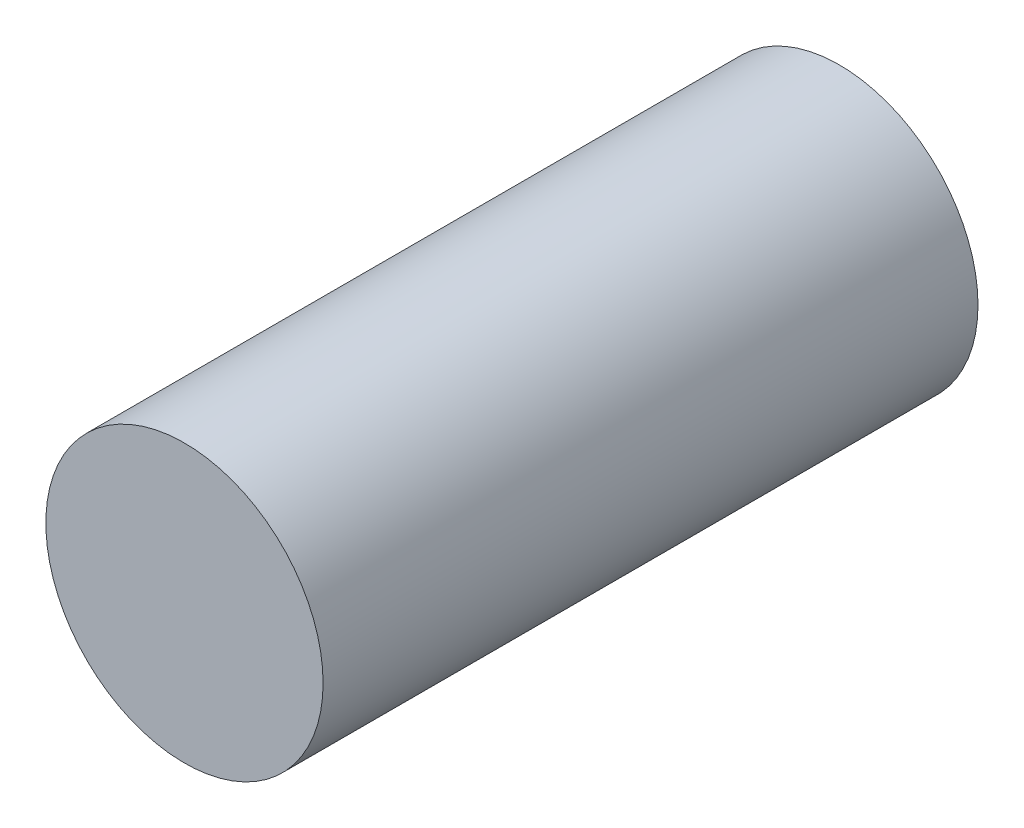
ISO-10303-21;
HEADER;
FILE_DESCRIPTION(('STEP AP214'),'2;1');
FILE_NAME('part.step','',(''),(''),'','','');
FILE_SCHEMA(('AUTOMOTIVE_DESIGN { 1 0 10303 214 1 1 1 1 }'));
ENDSEC;
DATA;
#1=APPLICATION_CONTEXT('core data for automotive mechanical design processes');
#2=APPLICATION_PROTOCOL_DEFINITION('international standard','automotive_design',2000,#1);
#3=PRODUCT_CONTEXT('',#1,'mechanical');
#4=PRODUCT('Part','Part','',(#3));
#5=PRODUCT_RELATED_PRODUCT_CATEGORY('part','',(#4));
#6=PRODUCT_DEFINITION_FORMATION('','',#4);
#7=PRODUCT_DEFINITION_CONTEXT('part definition',#1,'design');
#8=PRODUCT_DEFINITION('design','',#6,#7);
#9=PRODUCT_DEFINITION_SHAPE('','',#8);
#10=(LENGTH_UNIT() NAMED_UNIT(*) SI_UNIT(.MILLI.,.METRE.));
#11=(NAMED_UNIT(*) PLANE_ANGLE_UNIT() SI_UNIT($,.RADIAN.));
#12=(NAMED_UNIT(*) SI_UNIT($,.STERADIAN.) SOLID_ANGLE_UNIT());
#13=UNCERTAINTY_MEASURE_WITH_UNIT(LENGTH_MEASURE(1.E-05),#10,'distance_accuracy_value','');
#14=(GEOMETRIC_REPRESENTATION_CONTEXT(3) GLOBAL_UNCERTAINTY_ASSIGNED_CONTEXT((#13)) GLOBAL_UNIT_ASSIGNED_CONTEXT((#10,
#11,#12)) REPRESENTATION_CONTEXT('',''));
#15=CARTESIAN_POINT('',(0.,0.,0.));
#16=DIRECTION('',(0.,0.,1.));
#17=DIRECTION('',(1.,0.,0.));
#18=AXIS2_PLACEMENT_3D('',#15,#16,#17);
#19=CARTESIAN_POINT('',(0.,0.,60.));
#20=DIRECTION('',(0.,0.,-1.));
#21=DIRECTION('',(-1.,0.,0.));
#22=AXIS2_PLACEMENT_3D('',#19,#20,#21);
#23=CYLINDRICAL_SURFACE('',#22,12.7);
#24=CARTESIAN_POINT('',(0.,0.,60.));
#25=DIRECTION('',(0.,0.,1.));
#26=DIRECTION('',(1.,0.,0.));
#27=AXIS2_PLACEMENT_3D('',#24,#25,#26);
#28=CIRCLE('',#27,12.7);
#29=CARTESIAN_POINT('',(12.7,0.,60.));
#30=VERTEX_POINT('',#29);
#31=EDGE_CURVE('E10',#30,#30,#28,.T.);
#32=ORIENTED_EDGE('',*,*,#31,.F.);
#33=EDGE_LOOP('',(#32));
#34=FACE_BOUND('',#33,.T.);
#35=CARTESIAN_POINT('',(0.,0.,0.));
#36=DIRECTION('',(0.,0.,1.));
#37=DIRECTION('',(1.,0.,0.));
#38=AXIS2_PLACEMENT_3D('',#35,#36,#37);
#39=CIRCLE('',#38,12.7);
#40=CARTESIAN_POINT('',(12.7,0.,0.));
#41=VERTEX_POINT('',#40);
#42=EDGE_CURVE('E41',#41,#41,#39,.T.);
#43=ORIENTED_EDGE('',*,*,#42,.T.);
#44=EDGE_LOOP('',(#43));
#45=FACE_BOUND('',#44,.T.);
#46=ADVANCED_FACE('F38',(#34,#45),#23,.T.);
#47=CARTESIAN_POINT('',(0.,0.,60.));
#48=DIRECTION('',(0.,0.,1.));
#49=DIRECTION('',(1.,0.,0.));
#50=AXIS2_PLACEMENT_3D('',#47,#48,#49);
#51=PLANE('',#50);
#52=ORIENTED_EDGE('',*,*,#31,.T.);
#53=EDGE_LOOP('',(#52));
#54=FACE_BOUND('',#53,.T.);
#55=ADVANCED_FACE('F53',(#54),#51,.T.);
#56=CARTESIAN_POINT('',(0.,0.,0.));
#57=DIRECTION('',(0.,0.,1.));
#58=DIRECTION('',(1.,0.,0.));
#59=AXIS2_PLACEMENT_3D('',#56,#57,#58);
#60=PLANE('',#59);
#61=ORIENTED_EDGE('',*,*,#42,.F.);
#62=EDGE_LOOP('',(#61));
#63=FACE_BOUND('',#62,.T.);
#64=ADVANCED_FACE('F51',(#63),#60,.F.);
#65=CLOSED_SHELL('',(#46,#55,#64));
#66=MANIFOLD_SOLID_BREP('B2',#65);
#67=ADVANCED_BREP_SHAPE_REPRESENTATION('',(#18,#66),#14);
#68=SHAPE_DEFINITION_REPRESENTATION(#9,#67);
ENDSEC;
END-ISO-10303-21;
